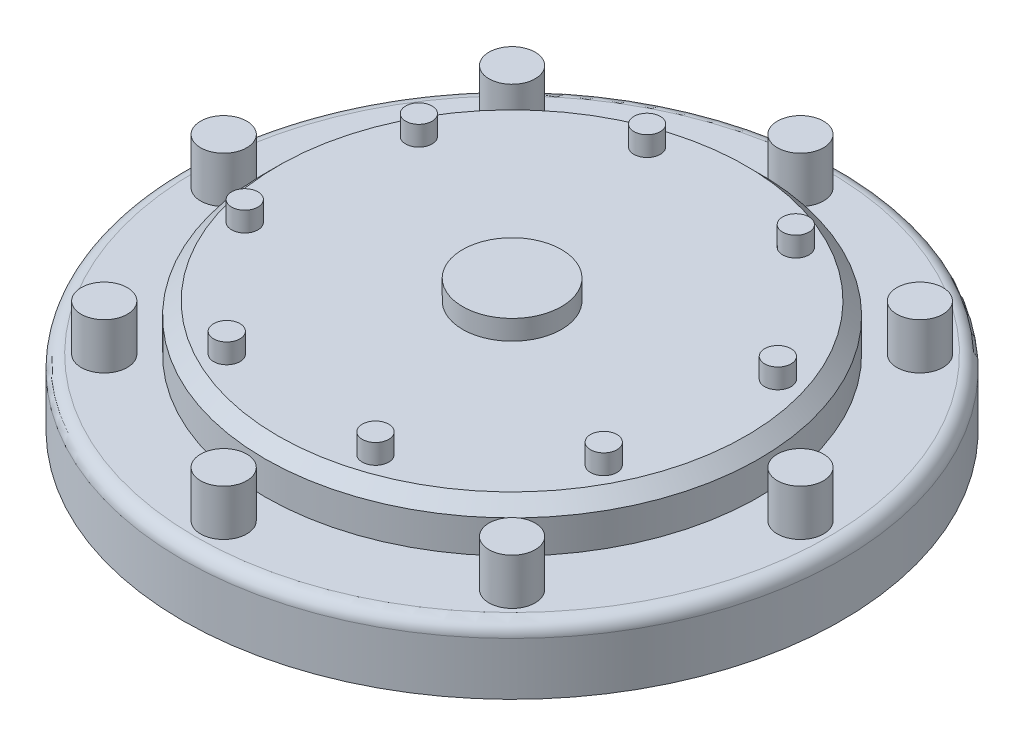
ISO-10303-21;
HEADER;
FILE_DESCRIPTION(('STEP AP214'),'2;1');
FILE_NAME('part.step','',(''),(''),'','','');
FILE_SCHEMA(('AUTOMOTIVE_DESIGN { 1 0 10303 214 1 1 1 1 }'));
ENDSEC;
DATA;
#1=APPLICATION_CONTEXT('core data for automotive mechanical design processes');
#2=APPLICATION_PROTOCOL_DEFINITION('international standard','automotive_design',2000,#1);
#3=PRODUCT_CONTEXT('',#1,'mechanical');
#4=PRODUCT('Part','Part','',(#3));
#5=PRODUCT_RELATED_PRODUCT_CATEGORY('part','',(#4));
#6=PRODUCT_DEFINITION_FORMATION('','',#4);
#7=PRODUCT_DEFINITION_CONTEXT('part definition',#1,'design');
#8=PRODUCT_DEFINITION('design','',#6,#7);
#9=PRODUCT_DEFINITION_SHAPE('','',#8);
#10=(LENGTH_UNIT() NAMED_UNIT(*) SI_UNIT(.MILLI.,.METRE.));
#11=(NAMED_UNIT(*) PLANE_ANGLE_UNIT() SI_UNIT($,.RADIAN.));
#12=(NAMED_UNIT(*) SI_UNIT($,.STERADIAN.) SOLID_ANGLE_UNIT());
#13=UNCERTAINTY_MEASURE_WITH_UNIT(LENGTH_MEASURE(1.E-05),#10,'distance_accuracy_value','');
#14=(GEOMETRIC_REPRESENTATION_CONTEXT(3) GLOBAL_UNCERTAINTY_ASSIGNED_CONTEXT((#13)) GLOBAL_UNIT_ASSIGNED_CONTEXT((#10,
#11,#12)) REPRESENTATION_CONTEXT('',''));
#15=CARTESIAN_POINT('',(0.,0.,0.));
#16=DIRECTION('',(0.,0.,1.));
#17=DIRECTION('',(1.,0.,0.));
#18=AXIS2_PLACEMENT_3D('',#15,#16,#17);
#19=CARTESIAN_POINT('',(0.,10.,0.));
#20=DIRECTION('',(0.,-1.,0.));
#21=DIRECTION('',(0.,0.,-1.));
#22=AXIS2_PLACEMENT_3D('',#19,#20,#21);
#23=CYLINDRICAL_SURFACE('',#22,50.);
#24=CARTESIAN_POINT('',(0.,8.,0.));
#25=DIRECTION('',(0.,1.,0.));
#26=DIRECTION('',(0.,0.,1.));
#27=AXIS2_PLACEMENT_3D('',#24,#25,#26);
#28=CIRCLE('',#27,50.);
#29=CARTESIAN_POINT('',(0.,8.,50.));
#30=VERTEX_POINT('',#29);
#31=EDGE_CURVE('E40',#30,#30,#28,.F.);
#32=ORIENTED_EDGE('',*,*,#31,.T.);
#33=EDGE_LOOP('',(#32));
#34=FACE_BOUND('',#33,.T.);
#35=CARTESIAN_POINT('',(0.,0.,0.));
#36=DIRECTION('',(0.,1.,0.));
#37=DIRECTION('',(0.,0.,1.));
#38=AXIS2_PLACEMENT_3D('',#35,#36,#37);
#39=CIRCLE('',#38,50.);
#40=CARTESIAN_POINT('',(0.,0.,50.));
#41=VERTEX_POINT('',#40);
#42=EDGE_CURVE('E57',#41,#41,#39,.T.);
#43=ORIENTED_EDGE('',*,*,#42,.T.);
#44=EDGE_LOOP('',(#43));
#45=FACE_BOUND('',#44,.T.);
#46=ADVANCED_FACE('F33',(#34,#45),#23,.T.);
#47=CARTESIAN_POINT('',(0.,10.,0.));
#48=DIRECTION('',(0.,1.,0.));
#49=DIRECTION('',(0.,0.,1.));
#50=AXIS2_PLACEMENT_3D('',#47,#48,#49);
#51=PLANE('',#50);
#52=CARTESIAN_POINT('',(0.,10.,0.));
#53=DIRECTION('',(0.,1.,0.));
#54=DIRECTION('',(0.,0.,1.));
#55=AXIS2_PLACEMENT_3D('',#52,#53,#54);
#56=CIRCLE('',#55,48.);
#57=CARTESIAN_POINT('',(0.,10.,48.));
#58=VERTEX_POINT('',#57);
#59=EDGE_CURVE('E44',#58,#58,#56,.T.);
#60=ORIENTED_EDGE('',*,*,#59,.T.);
#61=EDGE_LOOP('',(#60));
#62=FACE_BOUND('',#61,.T.);
#63=CARTESIAN_POINT('',(30.9359216769118,10.,30.9359216769111));
#64=DIRECTION('',(0.,1.,0.));
#65=DIRECTION('',(-0.707106781186539,0.,0.707106781186556));
#66=AXIS2_PLACEMENT_3D('',#63,#64,#65);
#67=CIRCLE('',#66,3.5);
#68=CARTESIAN_POINT('',(28.4610479427589,10.,33.410795411064));
#69=VERTEX_POINT('',#68);
#70=EDGE_CURVE('E107',#69,#69,#67,.T.);
#71=ORIENTED_EDGE('',*,*,#70,.F.);
#72=EDGE_LOOP('',(#71));
#73=FACE_BOUND('',#72,.T.);
#74=CARTESIAN_POINT('',(4.58256925723161E-13,10.,43.75));
#75=DIRECTION('',(0.,1.,0.));
#76=DIRECTION('',(-1.,0.,0.));
#77=AXIS2_PLACEMENT_3D('',#74,#75,#76);
#78=CIRCLE('',#77,3.5);
#79=CARTESIAN_POINT('',(-3.49999999999954,10.,43.75));
#80=VERTEX_POINT('',#79);
#81=EDGE_CURVE('E101',#80,#80,#78,.T.);
#82=ORIENTED_EDGE('',*,*,#81,.F.);
#83=EDGE_LOOP('',(#82));
#84=FACE_BOUND('',#83,.T.);
#85=CARTESIAN_POINT('',(-30.9359216769112,10.,30.9359216769117));
#86=DIRECTION('',(0.,1.,0.));
#87=DIRECTION('',(-0.707106781186554,0.,-0.707106781186541));
#88=AXIS2_PLACEMENT_3D('',#85,#86,#87);
#89=CIRCLE('',#88,3.5);
#90=CARTESIAN_POINT('',(-33.4107954110641,10.,28.4610479427588));
#91=VERTEX_POINT('',#90);
#92=EDGE_CURVE('E95',#91,#91,#89,.T.);
#93=ORIENTED_EDGE('',*,*,#92,.F.);
#94=EDGE_LOOP('',(#93));
#95=FACE_BOUND('',#94,.T.);
#96=CARTESIAN_POINT('',(-43.75,10.,0.));
#97=DIRECTION('',(0.,1.,0.));
#98=DIRECTION('',(0.,0.,-1.));
#99=AXIS2_PLACEMENT_3D('',#96,#97,#98);
#100=CIRCLE('',#99,3.5);
#101=CARTESIAN_POINT('',(-43.75,10.,-3.5));
#102=VERTEX_POINT('',#101);
#103=EDGE_CURVE('E89',#102,#102,#100,.T.);
#104=ORIENTED_EDGE('',*,*,#103,.F.);
#105=EDGE_LOOP('',(#104));
#106=FACE_BOUND('',#105,.T.);
#107=CARTESIAN_POINT('',(-30.9359216769116,10.,-30.9359216769113));
#108=DIRECTION('',(0.,1.,0.));
#109=DIRECTION('',(0.707106781186544,0.,-0.707106781186551));
#110=AXIS2_PLACEMENT_3D('',#107,#108,#109);
#111=CIRCLE('',#110,3.5);
#112=CARTESIAN_POINT('',(-28.4610479427587,10.,-33.4107954110642));
#113=VERTEX_POINT('',#112);
#114=EDGE_CURVE('E83',#113,#113,#111,.T.);
#115=ORIENTED_EDGE('',*,*,#114,.F.);
#116=EDGE_LOOP('',(#115));
#117=FACE_BOUND('',#116,.T.);
#118=CARTESIAN_POINT('',(-1.52752308574387E-13,10.,-43.75));
#119=DIRECTION('',(0.,1.,0.));
#120=DIRECTION('',(1.,0.,0.));
#121=AXIS2_PLACEMENT_3D('',#118,#119,#120);
#122=CIRCLE('',#121,3.5);
#123=CARTESIAN_POINT('',(3.49999999999985,10.,-43.75));
#124=VERTEX_POINT('',#123);
#125=EDGE_CURVE('E77',#124,#124,#122,.T.);
#126=ORIENTED_EDGE('',*,*,#125,.F.);
#127=EDGE_LOOP('',(#126));
#128=FACE_BOUND('',#127,.T.);
#129=CARTESIAN_POINT('',(30.9359216769114,10.,-30.9359216769115));
#130=DIRECTION('',(0.,1.,0.));
#131=DIRECTION('',(0.707106781186549,0.,0.707106781186546));
#132=AXIS2_PLACEMENT_3D('',#129,#130,#131);
#133=CIRCLE('',#132,3.5);
#134=CARTESIAN_POINT('',(33.4107954110643,10.,-28.4610479427586));
#135=VERTEX_POINT('',#134);
#136=EDGE_CURVE('E71',#135,#135,#133,.T.);
#137=ORIENTED_EDGE('',*,*,#136,.F.);
#138=EDGE_LOOP('',(#137));
#139=FACE_BOUND('',#138,.T.);
#140=CARTESIAN_POINT('',(43.75,10.,0.));
#141=DIRECTION('',(0.,1.,0.));
#142=DIRECTION('',(0.,0.,1.));
#143=AXIS2_PLACEMENT_3D('',#140,#141,#142);
#144=CIRCLE('',#143,3.5);
#145=CARTESIAN_POINT('',(43.75,10.,3.5));
#146=VERTEX_POINT('',#145);
#147=EDGE_CURVE('E65',#146,#146,#144,.T.);
#148=ORIENTED_EDGE('',*,*,#147,.F.);
#149=EDGE_LOOP('',(#148));
#150=FACE_BOUND('',#149,.T.);
#151=CARTESIAN_POINT('',(0.,10.,0.));
#152=DIRECTION('',(0.,1.,0.));
#153=DIRECTION('',(0.,0.,1.));
#154=AXIS2_PLACEMENT_3D('',#151,#152,#153);
#155=CIRCLE('',#154,37.5);
#156=CARTESIAN_POINT('',(0.,10.,37.5));
#157=VERTEX_POINT('',#156);
#158=EDGE_CURVE('E56',#157,#157,#155,.T.);
#159=ORIENTED_EDGE('',*,*,#158,.F.);
#160=EDGE_LOOP('',(#159));
#161=FACE_BOUND('',#160,.T.);
#162=ADVANCED_FACE('F181',(#62,#73,#84,#95,#106,#117,#128,#139,#150,#161),#51,.T.);
#163=CARTESIAN_POINT('',(0.,0.,0.));
#164=DIRECTION('',(0.,1.,0.));
#165=DIRECTION('',(0.,0.,1.));
#166=AXIS2_PLACEMENT_3D('',#163,#164,#165);
#167=PLANE('',#166);
#168=CARTESIAN_POINT('',(0.,0.,0.));
#169=DIRECTION('',(0.,1.,0.));
#170=DIRECTION('',(0.,0.,1.));
#171=AXIS2_PLACEMENT_3D('',#168,#169,#170);
#172=CIRCLE('',#171,7.5);
#173=CARTESIAN_POINT('',(0.,0.,7.5));
#174=VERTEX_POINT('',#173);
#175=EDGE_CURVE('E156',#174,#174,#172,.T.);
#176=ORIENTED_EDGE('',*,*,#175,.T.);
#177=EDGE_LOOP('',(#176));
#178=FACE_BOUND('',#177,.T.);
#179=ORIENTED_EDGE('',*,*,#42,.F.);
#180=EDGE_LOOP('',(#179));
#181=FACE_BOUND('',#180,.T.);
#182=ADVANCED_FACE('F177',(#178,#181),#167,.F.);
#183=CARTESIAN_POINT('',(0.,17.,0.));
#184=DIRECTION('',(0.,-1.,0.));
#185=DIRECTION('',(0.,0.,-1.));
#186=AXIS2_PLACEMENT_3D('',#183,#184,#185);
#187=CYLINDRICAL_SURFACE('',#186,37.5);
#188=CARTESIAN_POINT('',(0.,15.,0.));
#189=DIRECTION('',(0.,1.,0.));
#190=DIRECTION('',(0.,0.,1.));
#191=AXIS2_PLACEMENT_3D('',#188,#189,#190);
#192=CIRCLE('',#191,37.5);
#193=CARTESIAN_POINT('',(0.,15.,37.5));
#194=VERTEX_POINT('',#193);
#195=EDGE_CURVE('E48',#194,#194,#192,.F.);
#196=ORIENTED_EDGE('',*,*,#195,.T.);
#197=EDGE_LOOP('',(#196));
#198=FACE_BOUND('',#197,.T.);
#199=ORIENTED_EDGE('',*,*,#158,.T.);
#200=EDGE_LOOP('',(#199));
#201=FACE_BOUND('',#200,.T.);
#202=ADVANCED_FACE('F180',(#198,#201),#187,.T.);
#203=CARTESIAN_POINT('',(0.,17.,0.));
#204=DIRECTION('',(0.,1.,0.));
#205=DIRECTION('',(0.,0.,1.));
#206=AXIS2_PLACEMENT_3D('',#203,#204,#205);
#207=PLANE('',#206);
#208=CARTESIAN_POINT('',(0.,17.,0.));
#209=DIRECTION('',(0.,1.,0.));
#210=DIRECTION('',(0.,0.,1.));
#211=AXIS2_PLACEMENT_3D('',#208,#209,#210);
#212=CIRCLE('',#211,7.5);
#213=CARTESIAN_POINT('',(0.,17.,7.5));
#214=VERTEX_POINT('',#213);
#215=EDGE_CURVE('E10',#214,#214,#212,.T.);
#216=ORIENTED_EDGE('',*,*,#215,.F.);
#217=EDGE_LOOP('',(#216));
#218=FACE_BOUND('',#217,.T.);
#219=CARTESIAN_POINT('',(0.,17.,0.));
#220=DIRECTION('',(0.,1.,0.));
#221=DIRECTION('',(0.,0.,1.));
#222=AXIS2_PLACEMENT_3D('',#219,#220,#221);
#223=CIRCLE('',#222,35.5);
#224=CARTESIAN_POINT('',(0.,17.,35.5));
#225=VERTEX_POINT('',#224);
#226=EDGE_CURVE('E53',#225,#225,#223,.T.);
#227=ORIENTED_EDGE('',*,*,#226,.T.);
#228=EDGE_LOOP('',(#227));
#229=FACE_BOUND('',#228,.T.);
#230=CARTESIAN_POINT('',(28.5067272985495,17.,14.5973447413507));
#231=DIRECTION('',(0.,1.,0.));
#232=DIRECTION('',(-0.707106781186539,0.,0.707106781186556));
#233=AXIS2_PLACEMENT_3D('',#230,#231,#232);
#234=CIRCLE('',#233,2.);
#235=CARTESIAN_POINT('',(27.0925137361764,17.,16.0115583037238));
#236=VERTEX_POINT('',#235);
#237=EDGE_CURVE('E153',#236,#236,#234,.T.);
#238=ORIENTED_EDGE('',*,*,#237,.F.);
#239=EDGE_LOOP('',(#238));
#240=FACE_BOUND('',#239,.T.);
#241=CARTESIAN_POINT('',(9.82993725283463,17.,30.5488303858526));
#242=DIRECTION('',(0.,1.,0.));
#243=DIRECTION('',(-1.,0.,0.));
#244=AXIS2_PLACEMENT_3D('',#241,#242,#243);
#245=CIRCLE('',#244,2.);
#246=CARTESIAN_POINT('',(7.82993725283463,17.,30.5488303858526));
#247=VERTEX_POINT('',#246);
#248=EDGE_CURVE('E147',#247,#247,#245,.T.);
#249=ORIENTED_EDGE('',*,*,#248,.F.);
#250=EDGE_LOOP('',(#249));
#251=FACE_BOUND('',#250,.T.);
#252=CARTESIAN_POINT('',(-14.6559513085149,17.,28.6217491629572));
#253=DIRECTION('',(0.,1.,0.));
#254=DIRECTION('',(-0.707106781186554,0.,-0.707106781186541));
#255=AXIS2_PLACEMENT_3D('',#252,#253,#254);
#256=CIRCLE('',#255,2.);
#257=CARTESIAN_POINT('',(-16.070164870888,17.,27.2075356005841));
#258=VERTEX_POINT('',#257);
#259=EDGE_CURVE('E141',#258,#258,#256,.T.);
#260=ORIENTED_EDGE('',*,*,#259,.F.);
#261=EDGE_LOOP('',(#260));
#262=FACE_BOUND('',#261,.T.);
#263=CARTESIAN_POINT('',(-30.6074369530167,17.,9.94495911724207));
#264=DIRECTION('',(0.,1.,0.));
#265=DIRECTION('',(0.,0.,-1.));
#266=AXIS2_PLACEMENT_3D('',#263,#264,#265);
#267=CIRCLE('',#266,2.);
#268=CARTESIAN_POINT('',(-30.6074369530167,17.,7.94495911724207));
#269=VERTEX_POINT('',#268);
#270=EDGE_CURVE('E135',#269,#269,#267,.T.);
#271=ORIENTED_EDGE('',*,*,#270,.F.);
#272=EDGE_LOOP('',(#271));
#273=FACE_BOUND('',#272,.T.);
#274=CARTESIAN_POINT('',(-28.6803557301212,17.,-14.5409294441072));
#275=DIRECTION('',(0.,1.,0.));
#276=DIRECTION('',(0.707106781186544,0.,-0.707106781186551));
#277=AXIS2_PLACEMENT_3D('',#274,#275,#276);
#278=CIRCLE('',#277,2.);
#279=CARTESIAN_POINT('',(-27.2661421677481,17.,-15.9551430064803));
#280=VERTEX_POINT('',#279);
#281=EDGE_CURVE('E129',#280,#280,#278,.T.);
#282=ORIENTED_EDGE('',*,*,#281,.F.);
#283=EDGE_LOOP('',(#282));
#284=FACE_BOUND('',#283,.T.);
#285=CARTESIAN_POINT('',(-10.0035656844062,17.,-30.4924150886089));
#286=DIRECTION('',(0.,1.,0.));
#287=DIRECTION('',(1.,0.,0.));
#288=AXIS2_PLACEMENT_3D('',#285,#286,#287);
#289=CIRCLE('',#288,2.);
#290=CARTESIAN_POINT('',(-8.00356568440622,17.,-30.4924150886089));
#291=VERTEX_POINT('',#290);
#292=EDGE_CURVE('E123',#291,#291,#289,.T.);
#293=ORIENTED_EDGE('',*,*,#292,.F.);
#294=EDGE_LOOP('',(#293));
#295=FACE_BOUND('',#294,.T.);
#296=CARTESIAN_POINT('',(14.4823228769433,17.,-28.5653338657134));
#297=DIRECTION('',(0.,1.,0.));
#298=DIRECTION('',(0.707106781186549,0.,0.707106781186546));
#299=AXIS2_PLACEMENT_3D('',#296,#297,#298);
#300=CIRCLE('',#299,2.);
#301=CARTESIAN_POINT('',(15.8965364393164,17.,-27.1511203033403));
#302=VERTEX_POINT('',#301);
#303=EDGE_CURVE('E117',#302,#302,#300,.T.);
#304=ORIENTED_EDGE('',*,*,#303,.F.);
#305=EDGE_LOOP('',(#304));
#306=FACE_BOUND('',#305,.T.);
#307=CARTESIAN_POINT('',(30.4338085214449,17.,-9.88854381999835));
#308=DIRECTION('',(0.,1.,0.));
#309=DIRECTION('',(0.,0.,1.));
#310=AXIS2_PLACEMENT_3D('',#307,#308,#309);
#311=CIRCLE('',#310,2.);
#312=CARTESIAN_POINT('',(30.4338085214449,17.,-7.88854381999835));
#313=VERTEX_POINT('',#312);
#314=EDGE_CURVE('E111',#313,#313,#311,.T.);
#315=ORIENTED_EDGE('',*,*,#314,.F.);
#316=EDGE_LOOP('',(#315));
#317=FACE_BOUND('',#316,.T.);
#318=ADVANCED_FACE('F209',(#218,#229,#240,#251,#262,#273,#284,#295,#306,#317),#207,.T.);
#319=CARTESIAN_POINT('',(43.75,26.8994949366117,0.));
#320=DIRECTION('',(0.,-1.,0.));
#321=DIRECTION('',(0.,0.,-1.));
#322=AXIS2_PLACEMENT_3D('',#319,#320,#321);
#323=CYLINDRICAL_SURFACE('',#322,3.5);
#324=ORIENTED_EDGE('',*,*,#147,.T.);
#325=EDGE_LOOP('',(#324));
#326=FACE_BOUND('',#325,.T.);
#327=CARTESIAN_POINT('',(43.75,17.,0.));
#328=DIRECTION('',(0.,1.,0.));
#329=DIRECTION('',(0.,0.,1.));
#330=AXIS2_PLACEMENT_3D('',#327,#328,#329);
#331=CIRCLE('',#330,3.5);
#332=CARTESIAN_POINT('',(43.75,17.,3.5));
#333=VERTEX_POINT('',#332);
#334=EDGE_CURVE('E60',#333,#333,#331,.T.);
#335=ORIENTED_EDGE('',*,*,#334,.F.);
#336=EDGE_LOOP('',(#335));
#337=FACE_BOUND('',#336,.T.);
#338=ADVANCED_FACE('F212',(#326,#337),#323,.T.);
#339=CARTESIAN_POINT('',(0.,17.,0.));
#340=DIRECTION('',(0.,1.,0.));
#341=DIRECTION('',(0.,0.,1.));
#342=AXIS2_PLACEMENT_3D('',#339,#340,#341);
#343=PLANE('',#342);
#344=ORIENTED_EDGE('',*,*,#334,.T.);
#345=EDGE_LOOP('',(#344));
#346=FACE_BOUND('',#345,.T.);
#347=ADVANCED_FACE('F297',(#346),#343,.T.);
#348=CARTESIAN_POINT('',(30.9359216769114,26.8994949366117,-30.9359216769115));
#349=DIRECTION('',(0.,-1.,0.));
#350=DIRECTION('',(0.,0.,-1.));
#351=AXIS2_PLACEMENT_3D('',#348,#349,#350);
#352=CYLINDRICAL_SURFACE('',#351,3.5);
#353=ORIENTED_EDGE('',*,*,#136,.T.);
#354=EDGE_LOOP('',(#353));
#355=FACE_BOUND('',#354,.T.);
#356=CARTESIAN_POINT('',(30.9359216769114,17.,-30.9359216769115));
#357=DIRECTION('',(0.,1.,0.));
#358=DIRECTION('',(0.,0.,1.));
#359=AXIS2_PLACEMENT_3D('',#356,#357,#358);
#360=CIRCLE('',#359,3.5);
#361=CARTESIAN_POINT('',(30.9359216769114,17.,-27.4359216769115));
#362=VERTEX_POINT('',#361);
#363=EDGE_CURVE('E68',#362,#362,#360,.T.);
#364=ORIENTED_EDGE('',*,*,#363,.F.);
#365=EDGE_LOOP('',(#364));
#366=FACE_BOUND('',#365,.T.);
#367=ADVANCED_FACE('F294',(#355,#366),#352,.T.);
#368=CARTESIAN_POINT('',(0.,17.,0.));
#369=DIRECTION('',(0.,1.,0.));
#370=DIRECTION('',(0.,0.,1.));
#371=AXIS2_PLACEMENT_3D('',#368,#369,#370);
#372=PLANE('',#371);
#373=ORIENTED_EDGE('',*,*,#363,.T.);
#374=EDGE_LOOP('',(#373));
#375=FACE_BOUND('',#374,.T.);
#376=ADVANCED_FACE('F289',(#375),#372,.T.);
#377=CARTESIAN_POINT('',(-1.52752308574387E-13,26.8994949366117,-43.75));
#378=DIRECTION('',(0.,-1.,0.));
#379=DIRECTION('',(0.,0.,-1.));
#380=AXIS2_PLACEMENT_3D('',#377,#378,#379);
#381=CYLINDRICAL_SURFACE('',#380,3.5);
#382=ORIENTED_EDGE('',*,*,#125,.T.);
#383=EDGE_LOOP('',(#382));
#384=FACE_BOUND('',#383,.T.);
#385=CARTESIAN_POINT('',(-1.52752308574387E-13,17.,-43.75));
#386=DIRECTION('',(0.,1.,0.));
#387=DIRECTION('',(0.,0.,1.));
#388=AXIS2_PLACEMENT_3D('',#385,#386,#387);
#389=CIRCLE('',#388,3.5);
#390=CARTESIAN_POINT('',(-1.52752308574387E-13,17.,-40.25));
#391=VERTEX_POINT('',#390);
#392=EDGE_CURVE('E74',#391,#391,#389,.T.);
#393=ORIENTED_EDGE('',*,*,#392,.F.);
#394=EDGE_LOOP('',(#393));
#395=FACE_BOUND('',#394,.T.);
#396=ADVANCED_FACE('F286',(#384,#395),#381,.T.);
#397=CARTESIAN_POINT('',(0.,17.,0.));
#398=DIRECTION('',(0.,1.,0.));
#399=DIRECTION('',(0.,0.,1.));
#400=AXIS2_PLACEMENT_3D('',#397,#398,#399);
#401=PLANE('',#400);
#402=ORIENTED_EDGE('',*,*,#392,.T.);
#403=EDGE_LOOP('',(#402));
#404=FACE_BOUND('',#403,.T.);
#405=ADVANCED_FACE('F281',(#404),#401,.T.);
#406=CARTESIAN_POINT('',(-30.9359216769116,26.8994949366117,-30.9359216769113));
#407=DIRECTION('',(0.,-1.,0.));
#408=DIRECTION('',(0.,0.,-1.));
#409=AXIS2_PLACEMENT_3D('',#406,#407,#408);
#410=CYLINDRICAL_SURFACE('',#409,3.5);
#411=ORIENTED_EDGE('',*,*,#114,.T.);
#412=EDGE_LOOP('',(#411));
#413=FACE_BOUND('',#412,.T.);
#414=CARTESIAN_POINT('',(-30.9359216769116,17.,-30.9359216769113));
#415=DIRECTION('',(0.,1.,0.));
#416=DIRECTION('',(0.,0.,1.));
#417=AXIS2_PLACEMENT_3D('',#414,#415,#416);
#418=CIRCLE('',#417,3.5);
#419=CARTESIAN_POINT('',(-30.9359216769116,17.,-27.4359216769113));
#420=VERTEX_POINT('',#419);
#421=EDGE_CURVE('E80',#420,#420,#418,.T.);
#422=ORIENTED_EDGE('',*,*,#421,.F.);
#423=EDGE_LOOP('',(#422));
#424=FACE_BOUND('',#423,.T.);
#425=ADVANCED_FACE('F278',(#413,#424),#410,.T.);
#426=CARTESIAN_POINT('',(0.,17.,0.));
#427=DIRECTION('',(0.,1.,0.));
#428=DIRECTION('',(0.,0.,1.));
#429=AXIS2_PLACEMENT_3D('',#426,#427,#428);
#430=PLANE('',#429);
#431=ORIENTED_EDGE('',*,*,#421,.T.);
#432=EDGE_LOOP('',(#431));
#433=FACE_BOUND('',#432,.T.);
#434=ADVANCED_FACE('F273',(#433),#430,.T.);
#435=CARTESIAN_POINT('',(-43.75,26.8994949366117,0.));
#436=DIRECTION('',(0.,-1.,0.));
#437=DIRECTION('',(0.,0.,-1.));
#438=AXIS2_PLACEMENT_3D('',#435,#436,#437);
#439=CYLINDRICAL_SURFACE('',#438,3.5);
#440=ORIENTED_EDGE('',*,*,#103,.T.);
#441=EDGE_LOOP('',(#440));
#442=FACE_BOUND('',#441,.T.);
#443=CARTESIAN_POINT('',(-43.75,17.,0.));
#444=DIRECTION('',(0.,1.,0.));
#445=DIRECTION('',(0.,0.,1.));
#446=AXIS2_PLACEMENT_3D('',#443,#444,#445);
#447=CIRCLE('',#446,3.5);
#448=CARTESIAN_POINT('',(-43.75,17.,3.5));
#449=VERTEX_POINT('',#448);
#450=EDGE_CURVE('E86',#449,#449,#447,.T.);
#451=ORIENTED_EDGE('',*,*,#450,.F.);
#452=EDGE_LOOP('',(#451));
#453=FACE_BOUND('',#452,.T.);
#454=ADVANCED_FACE('F270',(#442,#453),#439,.T.);
#455=CARTESIAN_POINT('',(0.,17.,0.));
#456=DIRECTION('',(0.,1.,0.));
#457=DIRECTION('',(0.,0.,1.));
#458=AXIS2_PLACEMENT_3D('',#455,#456,#457);
#459=PLANE('',#458);
#460=ORIENTED_EDGE('',*,*,#450,.T.);
#461=EDGE_LOOP('',(#460));
#462=FACE_BOUND('',#461,.T.);
#463=ADVANCED_FACE('F265',(#462),#459,.T.);
#464=CARTESIAN_POINT('',(-30.9359216769112,26.8994949366117,30.9359216769117));
#465=DIRECTION('',(0.,-1.,0.));
#466=DIRECTION('',(0.,0.,-1.));
#467=AXIS2_PLACEMENT_3D('',#464,#465,#466);
#468=CYLINDRICAL_SURFACE('',#467,3.5);
#469=ORIENTED_EDGE('',*,*,#92,.T.);
#470=EDGE_LOOP('',(#469));
#471=FACE_BOUND('',#470,.T.);
#472=CARTESIAN_POINT('',(-30.9359216769112,17.,30.9359216769117));
#473=DIRECTION('',(0.,1.,0.));
#474=DIRECTION('',(0.,0.,1.));
#475=AXIS2_PLACEMENT_3D('',#472,#473,#474);
#476=CIRCLE('',#475,3.5);
#477=CARTESIAN_POINT('',(-30.9359216769112,17.,34.4359216769117));
#478=VERTEX_POINT('',#477);
#479=EDGE_CURVE('E92',#478,#478,#476,.T.);
#480=ORIENTED_EDGE('',*,*,#479,.F.);
#481=EDGE_LOOP('',(#480));
#482=FACE_BOUND('',#481,.T.);
#483=ADVANCED_FACE('F262',(#471,#482),#468,.T.);
#484=CARTESIAN_POINT('',(0.,17.,0.));
#485=DIRECTION('',(0.,1.,0.));
#486=DIRECTION('',(0.,0.,1.));
#487=AXIS2_PLACEMENT_3D('',#484,#485,#486);
#488=PLANE('',#487);
#489=ORIENTED_EDGE('',*,*,#479,.T.);
#490=EDGE_LOOP('',(#489));
#491=FACE_BOUND('',#490,.T.);
#492=ADVANCED_FACE('F257',(#491),#488,.T.);
#493=CARTESIAN_POINT('',(4.58256925723161E-13,26.8994949366117,43.75));
#494=DIRECTION('',(0.,-1.,0.));
#495=DIRECTION('',(0.,0.,-1.));
#496=AXIS2_PLACEMENT_3D('',#493,#494,#495);
#497=CYLINDRICAL_SURFACE('',#496,3.5);
#498=ORIENTED_EDGE('',*,*,#81,.T.);
#499=EDGE_LOOP('',(#498));
#500=FACE_BOUND('',#499,.T.);
#501=CARTESIAN_POINT('',(4.58256925723161E-13,17.,43.75));
#502=DIRECTION('',(0.,1.,0.));
#503=DIRECTION('',(0.,0.,1.));
#504=AXIS2_PLACEMENT_3D('',#501,#502,#503);
#505=CIRCLE('',#504,3.5);
#506=CARTESIAN_POINT('',(4.58256925723161E-13,17.,47.25));
#507=VERTEX_POINT('',#506);
#508=EDGE_CURVE('E98',#507,#507,#505,.T.);
#509=ORIENTED_EDGE('',*,*,#508,.F.);
#510=EDGE_LOOP('',(#509));
#511=FACE_BOUND('',#510,.T.);
#512=ADVANCED_FACE('F254',(#500,#511),#497,.T.);
#513=CARTESIAN_POINT('',(0.,17.,0.));
#514=DIRECTION('',(0.,1.,0.));
#515=DIRECTION('',(0.,0.,1.));
#516=AXIS2_PLACEMENT_3D('',#513,#514,#515);
#517=PLANE('',#516);
#518=ORIENTED_EDGE('',*,*,#508,.T.);
#519=EDGE_LOOP('',(#518));
#520=FACE_BOUND('',#519,.T.);
#521=ADVANCED_FACE('F251',(#520),#517,.T.);
#522=CARTESIAN_POINT('',(30.9359216769118,26.8994949366117,30.9359216769111));
#523=DIRECTION('',(0.,-1.,0.));
#524=DIRECTION('',(0.,0.,-1.));
#525=AXIS2_PLACEMENT_3D('',#522,#523,#524);
#526=CYLINDRICAL_SURFACE('',#525,3.5);
#527=ORIENTED_EDGE('',*,*,#70,.T.);
#528=EDGE_LOOP('',(#527));
#529=FACE_BOUND('',#528,.T.);
#530=CARTESIAN_POINT('',(30.9359216769118,17.,30.9359216769111));
#531=DIRECTION('',(0.,1.,0.));
#532=DIRECTION('',(0.,0.,1.));
#533=AXIS2_PLACEMENT_3D('',#530,#531,#532);
#534=CIRCLE('',#533,3.5);
#535=CARTESIAN_POINT('',(30.9359216769118,17.,34.4359216769111));
#536=VERTEX_POINT('',#535);
#537=EDGE_CURVE('E104',#536,#536,#534,.T.);
#538=ORIENTED_EDGE('',*,*,#537,.F.);
#539=EDGE_LOOP('',(#538));
#540=FACE_BOUND('',#539,.T.);
#541=ADVANCED_FACE('F244',(#529,#540),#526,.T.);
#542=CARTESIAN_POINT('',(0.,17.,0.));
#543=DIRECTION('',(0.,1.,0.));
#544=DIRECTION('',(0.,0.,1.));
#545=AXIS2_PLACEMENT_3D('',#542,#543,#544);
#546=PLANE('',#545);
#547=ORIENTED_EDGE('',*,*,#537,.T.);
#548=EDGE_LOOP('',(#547));
#549=FACE_BOUND('',#548,.T.);
#550=ADVANCED_FACE('F234',(#549),#546,.T.);
#551=CARTESIAN_POINT('',(30.4338085214449,20.,-9.88854381999835));
#552=DIRECTION('',(0.,-1.,0.));
#553=DIRECTION('',(0.,0.,-1.));
#554=AXIS2_PLACEMENT_3D('',#551,#552,#553);
#555=CYLINDRICAL_SURFACE('',#554,2.);
#556=CARTESIAN_POINT('',(30.4338085214449,20.,-9.88854381999835));
#557=DIRECTION('',(0.,1.,0.));
#558=DIRECTION('',(0.,0.,1.));
#559=AXIS2_PLACEMENT_3D('',#556,#557,#558);
#560=CIRCLE('',#559,2.);
#561=CARTESIAN_POINT('',(30.4338085214449,20.,-7.88854381999835));
#562=VERTEX_POINT('',#561);
#563=EDGE_CURVE('E110',#562,#562,#560,.T.);
#564=ORIENTED_EDGE('',*,*,#563,.F.);
#565=EDGE_LOOP('',(#564));
#566=FACE_BOUND('',#565,.T.);
#567=ORIENTED_EDGE('',*,*,#314,.T.);
#568=EDGE_LOOP('',(#567));
#569=FACE_BOUND('',#568,.T.);
#570=ADVANCED_FACE('F231',(#566,#569),#555,.T.);
#571=CARTESIAN_POINT('',(30.4338085214449,20.,-9.88854381999835));
#572=DIRECTION('',(0.,1.,0.));
#573=DIRECTION('',(0.,0.,1.));
#574=AXIS2_PLACEMENT_3D('',#571,#572,#573);
#575=PLANE('',#574);
#576=ORIENTED_EDGE('',*,*,#563,.T.);
#577=EDGE_LOOP('',(#576));
#578=FACE_BOUND('',#577,.T.);
#579=ADVANCED_FACE('F233',(#578),#575,.T.);
#580=CARTESIAN_POINT('',(14.4823228769433,20.,-28.5653338657134));
#581=DIRECTION('',(0.,-1.,0.));
#582=DIRECTION('',(0.,0.,-1.));
#583=AXIS2_PLACEMENT_3D('',#580,#581,#582);
#584=CYLINDRICAL_SURFACE('',#583,2.);
#585=CARTESIAN_POINT('',(14.4823228769433,20.,-28.5653338657134));
#586=DIRECTION('',(0.,1.,0.));
#587=DIRECTION('',(0.707106781186549,0.,0.707106781186546));
#588=AXIS2_PLACEMENT_3D('',#585,#586,#587);
#589=CIRCLE('',#588,2.);
#590=CARTESIAN_POINT('',(15.8965364393164,20.,-27.1511203033403));
#591=VERTEX_POINT('',#590);
#592=EDGE_CURVE('E114',#591,#591,#589,.T.);
#593=ORIENTED_EDGE('',*,*,#592,.F.);
#594=EDGE_LOOP('',(#593));
#595=FACE_BOUND('',#594,.T.);
#596=ORIENTED_EDGE('',*,*,#303,.T.);
#597=EDGE_LOOP('',(#596));
#598=FACE_BOUND('',#597,.T.);
#599=ADVANCED_FACE('F241',(#595,#598),#584,.T.);
#600=CARTESIAN_POINT('',(14.4823228769433,20.,-28.5653338657134));
#601=DIRECTION('',(0.,1.,0.));
#602=DIRECTION('',(0.707106781186549,0.,0.707106781186546));
#603=AXIS2_PLACEMENT_3D('',#600,#601,#602);
#604=PLANE('',#603);
#605=ORIENTED_EDGE('',*,*,#592,.T.);
#606=EDGE_LOOP('',(#605));
#607=FACE_BOUND('',#606,.T.);
#608=ADVANCED_FACE('F412',(#607),#604,.T.);
#609=CARTESIAN_POINT('',(-10.0035656844062,20.,-30.4924150886089));
#610=DIRECTION('',(0.,-1.,0.));
#611=DIRECTION('',(0.,0.,-1.));
#612=AXIS2_PLACEMENT_3D('',#609,#610,#611);
#613=CYLINDRICAL_SURFACE('',#612,2.);
#614=CARTESIAN_POINT('',(-10.0035656844062,20.,-30.4924150886089));
#615=DIRECTION('',(0.,1.,0.));
#616=DIRECTION('',(1.,0.,0.));
#617=AXIS2_PLACEMENT_3D('',#614,#615,#616);
#618=CIRCLE('',#617,2.);
#619=CARTESIAN_POINT('',(-8.00356568440622,20.,-30.4924150886089));
#620=VERTEX_POINT('',#619);
#621=EDGE_CURVE('E120',#620,#620,#618,.T.);
#622=ORIENTED_EDGE('',*,*,#621,.F.);
#623=EDGE_LOOP('',(#622));
#624=FACE_BOUND('',#623,.T.);
#625=ORIENTED_EDGE('',*,*,#292,.T.);
#626=EDGE_LOOP('',(#625));
#627=FACE_BOUND('',#626,.T.);
#628=ADVANCED_FACE('F424',(#624,#627),#613,.T.);
#629=CARTESIAN_POINT('',(-10.0035656844062,20.,-30.4924150886089));
#630=DIRECTION('',(0.,1.,0.));
#631=DIRECTION('',(1.,0.,0.));
#632=AXIS2_PLACEMENT_3D('',#629,#630,#631);
#633=PLANE('',#632);
#634=ORIENTED_EDGE('',*,*,#621,.T.);
#635=EDGE_LOOP('',(#634));
#636=FACE_BOUND('',#635,.T.);
#637=ADVANCED_FACE('F437',(#636),#633,.T.);
#638=CARTESIAN_POINT('',(-28.6803557301212,20.,-14.5409294441072));
#639=DIRECTION('',(0.,-1.,0.));
#640=DIRECTION('',(0.,0.,-1.));
#641=AXIS2_PLACEMENT_3D('',#638,#639,#640);
#642=CYLINDRICAL_SURFACE('',#641,2.);
#643=CARTESIAN_POINT('',(-28.6803557301212,20.,-14.5409294441072));
#644=DIRECTION('',(0.,1.,0.));
#645=DIRECTION('',(0.707106781186544,0.,-0.707106781186551));
#646=AXIS2_PLACEMENT_3D('',#643,#644,#645);
#647=CIRCLE('',#646,2.);
#648=CARTESIAN_POINT('',(-27.2661421677481,20.,-15.9551430064803));
#649=VERTEX_POINT('',#648);
#650=EDGE_CURVE('E126',#649,#649,#647,.T.);
#651=ORIENTED_EDGE('',*,*,#650,.F.);
#652=EDGE_LOOP('',(#651));
#653=FACE_BOUND('',#652,.T.);
#654=ORIENTED_EDGE('',*,*,#281,.T.);
#655=EDGE_LOOP('',(#654));
#656=FACE_BOUND('',#655,.T.);
#657=ADVANCED_FACE('F450',(#653,#656),#642,.T.);
#658=CARTESIAN_POINT('',(-28.6803557301212,20.,-14.5409294441072));
#659=DIRECTION('',(0.,1.,0.));
#660=DIRECTION('',(0.707106781186544,0.,-0.707106781186551));
#661=AXIS2_PLACEMENT_3D('',#658,#659,#660);
#662=PLANE('',#661);
#663=ORIENTED_EDGE('',*,*,#650,.T.);
#664=EDGE_LOOP('',(#663));
#665=FACE_BOUND('',#664,.T.);
#666=ADVANCED_FACE('F461',(#665),#662,.T.);
#667=CARTESIAN_POINT('',(-30.6074369530167,20.,9.94495911724207));
#668=DIRECTION('',(0.,-1.,0.));
#669=DIRECTION('',(0.,0.,-1.));
#670=AXIS2_PLACEMENT_3D('',#667,#668,#669);
#671=CYLINDRICAL_SURFACE('',#670,2.);
#672=CARTESIAN_POINT('',(-30.6074369530167,20.,9.94495911724207));
#673=DIRECTION('',(0.,1.,0.));
#674=DIRECTION('',(0.,0.,-1.));
#675=AXIS2_PLACEMENT_3D('',#672,#673,#674);
#676=CIRCLE('',#675,2.);
#677=CARTESIAN_POINT('',(-30.6074369530167,20.,7.94495911724207));
#678=VERTEX_POINT('',#677);
#679=EDGE_CURVE('E132',#678,#678,#676,.T.);
#680=ORIENTED_EDGE('',*,*,#679,.F.);
#681=EDGE_LOOP('',(#680));
#682=FACE_BOUND('',#681,.T.);
#683=ORIENTED_EDGE('',*,*,#270,.T.);
#684=EDGE_LOOP('',(#683));
#685=FACE_BOUND('',#684,.T.);
#686=ADVANCED_FACE('F472',(#682,#685),#671,.T.);
#687=CARTESIAN_POINT('',(-30.6074369530167,20.,9.94495911724207));
#688=DIRECTION('',(0.,1.,0.));
#689=DIRECTION('',(0.,0.,-1.));
#690=AXIS2_PLACEMENT_3D('',#687,#688,#689);
#691=PLANE('',#690);
#692=ORIENTED_EDGE('',*,*,#679,.T.);
#693=EDGE_LOOP('',(#692));
#694=FACE_BOUND('',#693,.T.);
#695=ADVANCED_FACE('F483',(#694),#691,.T.);
#696=CARTESIAN_POINT('',(-14.6559513085149,20.,28.6217491629572));
#697=DIRECTION('',(0.,-1.,0.));
#698=DIRECTION('',(0.,0.,-1.));
#699=AXIS2_PLACEMENT_3D('',#696,#697,#698);
#700=CYLINDRICAL_SURFACE('',#699,2.);
#701=CARTESIAN_POINT('',(-14.6559513085149,20.,28.6217491629572));
#702=DIRECTION('',(0.,1.,0.));
#703=DIRECTION('',(-0.707106781186554,0.,-0.707106781186541));
#704=AXIS2_PLACEMENT_3D('',#701,#702,#703);
#705=CIRCLE('',#704,2.);
#706=CARTESIAN_POINT('',(-16.070164870888,20.,27.2075356005841));
#707=VERTEX_POINT('',#706);
#708=EDGE_CURVE('E138',#707,#707,#705,.T.);
#709=ORIENTED_EDGE('',*,*,#708,.F.);
#710=EDGE_LOOP('',(#709));
#711=FACE_BOUND('',#710,.T.);
#712=ORIENTED_EDGE('',*,*,#259,.T.);
#713=EDGE_LOOP('',(#712));
#714=FACE_BOUND('',#713,.T.);
#715=ADVANCED_FACE('F493',(#711,#714),#700,.T.);
#716=CARTESIAN_POINT('',(-14.6559513085149,20.,28.6217491629572));
#717=DIRECTION('',(0.,1.,0.));
#718=DIRECTION('',(-0.707106781186554,0.,-0.707106781186541));
#719=AXIS2_PLACEMENT_3D('',#716,#717,#718);
#720=PLANE('',#719);
#721=ORIENTED_EDGE('',*,*,#708,.T.);
#722=EDGE_LOOP('',(#721));
#723=FACE_BOUND('',#722,.T.);
#724=ADVANCED_FACE('F503',(#723),#720,.T.);
#725=CARTESIAN_POINT('',(9.82993725283463,20.,30.5488303858526));
#726=DIRECTION('',(0.,-1.,0.));
#727=DIRECTION('',(0.,0.,-1.));
#728=AXIS2_PLACEMENT_3D('',#725,#726,#727);
#729=CYLINDRICAL_SURFACE('',#728,2.);
#730=CARTESIAN_POINT('',(9.82993725283463,20.,30.5488303858526));
#731=DIRECTION('',(0.,1.,0.));
#732=DIRECTION('',(-1.,0.,0.));
#733=AXIS2_PLACEMENT_3D('',#730,#731,#732);
#734=CIRCLE('',#733,2.);
#735=CARTESIAN_POINT('',(7.82993725283463,20.,30.5488303858526));
#736=VERTEX_POINT('',#735);
#737=EDGE_CURVE('E144',#736,#736,#734,.T.);
#738=ORIENTED_EDGE('',*,*,#737,.F.);
#739=EDGE_LOOP('',(#738));
#740=FACE_BOUND('',#739,.T.);
#741=ORIENTED_EDGE('',*,*,#248,.T.);
#742=EDGE_LOOP('',(#741));
#743=FACE_BOUND('',#742,.T.);
#744=ADVANCED_FACE('F513',(#740,#743),#729,.T.);
#745=CARTESIAN_POINT('',(9.82993725283463,20.,30.5488303858526));
#746=DIRECTION('',(0.,1.,0.));
#747=DIRECTION('',(-1.,0.,0.));
#748=AXIS2_PLACEMENT_3D('',#745,#746,#747);
#749=PLANE('',#748);
#750=ORIENTED_EDGE('',*,*,#737,.T.);
#751=EDGE_LOOP('',(#750));
#752=FACE_BOUND('',#751,.T.);
#753=ADVANCED_FACE('F523',(#752),#749,.T.);
#754=CARTESIAN_POINT('',(28.5067272985495,20.,14.5973447413507));
#755=DIRECTION('',(0.,-1.,0.));
#756=DIRECTION('',(0.,0.,-1.));
#757=AXIS2_PLACEMENT_3D('',#754,#755,#756);
#758=CYLINDRICAL_SURFACE('',#757,2.);
#759=CARTESIAN_POINT('',(28.5067272985495,20.,14.5973447413507));
#760=DIRECTION('',(0.,1.,0.));
#761=DIRECTION('',(-0.707106781186539,0.,0.707106781186556));
#762=AXIS2_PLACEMENT_3D('',#759,#760,#761);
#763=CIRCLE('',#762,2.);
#764=CARTESIAN_POINT('',(27.0925137361764,20.,16.0115583037238));
#765=VERTEX_POINT('',#764);
#766=EDGE_CURVE('E150',#765,#765,#763,.T.);
#767=ORIENTED_EDGE('',*,*,#766,.F.);
#768=EDGE_LOOP('',(#767));
#769=FACE_BOUND('',#768,.T.);
#770=ORIENTED_EDGE('',*,*,#237,.T.);
#771=EDGE_LOOP('',(#770));
#772=FACE_BOUND('',#771,.T.);
#773=ADVANCED_FACE('F202',(#769,#772),#758,.T.);
#774=CARTESIAN_POINT('',(28.5067272985495,20.,14.5973447413507));
#775=DIRECTION('',(0.,1.,0.));
#776=DIRECTION('',(-0.707106781186539,0.,0.707106781186556));
#777=AXIS2_PLACEMENT_3D('',#774,#775,#776);
#778=PLANE('',#777);
#779=ORIENTED_EDGE('',*,*,#766,.T.);
#780=EDGE_LOOP('',(#779));
#781=FACE_BOUND('',#780,.T.);
#782=ADVANCED_FACE('F194',(#781),#778,.T.);
#783=CARTESIAN_POINT('',(0.,17.,0.));
#784=DIRECTION('',(0.,-1.,0.));
#785=DIRECTION('',(0.,0.,-1.));
#786=AXIS2_PLACEMENT_3D('',#783,#784,#785);
#787=CONICAL_SURFACE('',#786,35.5,0.785398163397447);
#788=ORIENTED_EDGE('',*,*,#195,.F.);
#789=EDGE_LOOP('',(#788));
#790=FACE_BOUND('',#789,.T.);
#791=ORIENTED_EDGE('',*,*,#226,.F.);
#792=EDGE_LOOP('',(#791));
#793=FACE_BOUND('',#792,.T.);
#794=ADVANCED_FACE('F192',(#790,#793),#787,.T.);
#795=CARTESIAN_POINT('',(0.,8.,0.));
#796=DIRECTION('',(0.,1.,0.));
#797=DIRECTION('',(0.,0.,1.));
#798=AXIS2_PLACEMENT_3D('',#795,#796,#797);
#799=TOROIDAL_SURFACE('',#798,48.,2.);
#800=ORIENTED_EDGE('',*,*,#31,.F.);
#801=EDGE_LOOP('',(#800));
#802=FACE_BOUND('',#801,.T.);
#803=ORIENTED_EDGE('',*,*,#59,.F.);
#804=EDGE_LOOP('',(#803));
#805=FACE_BOUND('',#804,.T.);
#806=ADVANCED_FACE('F35',(#802,#805),#799,.T.);
#807=CARTESIAN_POINT('',(0.,20.,0.));
#808=DIRECTION('',(0.,-1.,0.));
#809=DIRECTION('',(0.,0.,-1.));
#810=AXIS2_PLACEMENT_3D('',#807,#808,#809);
#811=PLANE('',#810);
#812=CARTESIAN_POINT('',(0.,20.,0.));
#813=DIRECTION('',(0.,-1.,0.));
#814=DIRECTION('',(0.,0.,-1.));
#815=AXIS2_PLACEMENT_3D('',#812,#813,#814);
#816=CIRCLE('',#815,7.5);
#817=CARTESIAN_POINT('',(0.,20.,-7.5));
#818=VERTEX_POINT('',#817);
#819=EDGE_CURVE('E161',#818,#818,#816,.T.);
#820=ORIENTED_EDGE('',*,*,#819,.F.);
#821=EDGE_LOOP('',(#820));
#822=FACE_BOUND('',#821,.T.);
#823=ADVANCED_FACE('F200',(#822),#811,.F.);
#824=CARTESIAN_POINT('',(0.,20.,0.));
#825=DIRECTION('',(0.,-1.,0.));
#826=DIRECTION('',(0.,0.,-1.));
#827=AXIS2_PLACEMENT_3D('',#824,#825,#826);
#828=CYLINDRICAL_SURFACE('',#827,7.5);
#829=ORIENTED_EDGE('',*,*,#215,.T.);
#830=EDGE_LOOP('',(#829));
#831=FACE_BOUND('',#830,.T.);
#832=ORIENTED_EDGE('',*,*,#819,.T.);
#833=EDGE_LOOP('',(#832));
#834=FACE_BOUND('',#833,.T.);
#835=ADVANCED_FACE('F173',(#831,#834),#828,.T.);
#836=CARTESIAN_POINT('',(0.,-20.,0.));
#837=DIRECTION('',(0.,-1.,0.));
#838=DIRECTION('',(0.,0.,-1.));
#839=AXIS2_PLACEMENT_3D('',#836,#837,#838);
#840=CIRCLE('',#839,7.5);
#841=CARTESIAN_POINT('',(0.,-20.,-7.5));
#842=VERTEX_POINT('',#841);
#843=EDGE_CURVE('E164',#842,#842,#840,.T.);
#844=ORIENTED_EDGE('',*,*,#843,.F.);
#845=EDGE_LOOP('',(#844));
#846=FACE_BOUND('',#845,.T.);
#847=ORIENTED_EDGE('',*,*,#175,.F.);
#848=EDGE_LOOP('',(#847));
#849=FACE_BOUND('',#848,.T.);
#850=ADVANCED_FACE('F170',(#846,#849),#828,.T.);
#851=CARTESIAN_POINT('',(0.,-20.,0.));
#852=DIRECTION('',(0.,-1.,0.));
#853=DIRECTION('',(0.,0.,-1.));
#854=AXIS2_PLACEMENT_3D('',#851,#852,#853);
#855=PLANE('',#854);
#856=ORIENTED_EDGE('',*,*,#843,.T.);
#857=EDGE_LOOP('',(#856));
#858=FACE_BOUND('',#857,.T.);
#859=ADVANCED_FACE('F168',(#858),#855,.T.);
#860=CLOSED_SHELL('',(#46,#162,#182,#202,#318,#338,#347,#367,#376,#396,#405,#425,#434,#454,#463,
#483,#492,#512,#521,#541,#550,#570,#579,#599,#608,#628,#637,#657,#666,#686,#695,#715,#724,#744,
#753,#773,#782,#794,#806,#823,#835,#850,#859));
#861=MANIFOLD_SOLID_BREP('B2',#860);
#862=ADVANCED_BREP_SHAPE_REPRESENTATION('',(#18,#861),#14);
#863=SHAPE_DEFINITION_REPRESENTATION(#9,#862);
ENDSEC;
END-ISO-10303-21;
